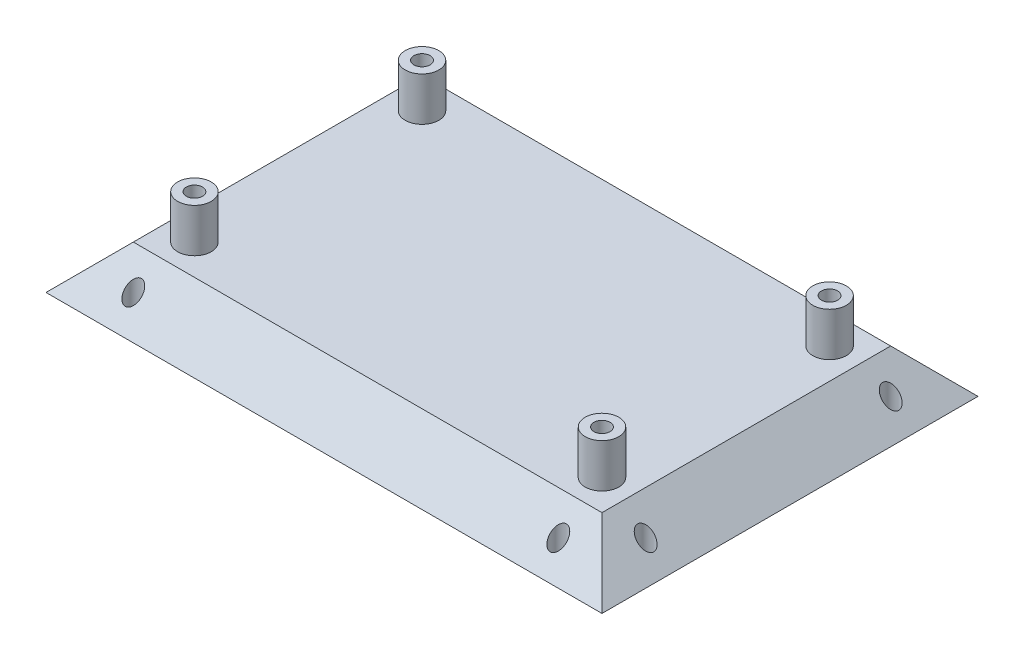
ISO-10303-21;
HEADER;
FILE_DESCRIPTION(('STEP AP214'),'2;1');
FILE_NAME('part.step','',(''),(''),'','','');
FILE_SCHEMA(('AUTOMOTIVE_DESIGN { 1 0 10303 214 1 1 1 1 }'));
ENDSEC;
DATA;
#1=APPLICATION_CONTEXT('core data for automotive mechanical design processes');
#2=APPLICATION_PROTOCOL_DEFINITION('international standard','automotive_design',2000,#1);
#3=PRODUCT_CONTEXT('',#1,'mechanical');
#4=PRODUCT('Part','Part','',(#3));
#5=PRODUCT_RELATED_PRODUCT_CATEGORY('part','',(#4));
#6=PRODUCT_DEFINITION_FORMATION('','',#4);
#7=PRODUCT_DEFINITION_CONTEXT('part definition',#1,'design');
#8=PRODUCT_DEFINITION('design','',#6,#7);
#9=PRODUCT_DEFINITION_SHAPE('','',#8);
#10=(LENGTH_UNIT() NAMED_UNIT(*) SI_UNIT(.MILLI.,.METRE.));
#11=(NAMED_UNIT(*) PLANE_ANGLE_UNIT() SI_UNIT($,.RADIAN.));
#12=(NAMED_UNIT(*) SI_UNIT($,.STERADIAN.) SOLID_ANGLE_UNIT());
#13=UNCERTAINTY_MEASURE_WITH_UNIT(LENGTH_MEASURE(1.E-05),#10,'distance_accuracy_value','');
#14=(GEOMETRIC_REPRESENTATION_CONTEXT(3) GLOBAL_UNCERTAINTY_ASSIGNED_CONTEXT((#13)) GLOBAL_UNIT_ASSIGNED_CONTEXT((#10,
#11,#12)) REPRESENTATION_CONTEXT('',''));
#15=CARTESIAN_POINT('',(0.,0.,0.));
#16=DIRECTION('',(0.,0.,1.));
#17=DIRECTION('',(1.,0.,0.));
#18=AXIS2_PLACEMENT_3D('',#15,#16,#17);
#19=CARTESIAN_POINT('',(0.,10.,0.));
#20=DIRECTION('',(0.,1.,0.));
#21=DIRECTION('',(0.,0.,1.));
#22=AXIS2_PLACEMENT_3D('',#19,#20,#21);
#23=PLANE('',#22);
#24=CARTESIAN_POINT('',(17.,10.,69.1254130139523));
#25=DIRECTION('',(0.,1.,0.));
#26=DIRECTION('',(0.,0.,-1.));
#27=AXIS2_PLACEMENT_3D('',#24,#25,#26);
#28=CIRCLE('',#27,3.85);
#29=CARTESIAN_POINT('',(17.,10.,65.2754130139523));
#30=VERTEX_POINT('',#29);
#31=EDGE_CURVE('E458',#30,#30,#28,.T.);
#32=ORIENTED_EDGE('',*,*,#31,.F.);
#33=EDGE_LOOP('',(#32));
#34=FACE_BOUND('',#33,.T.);
#35=CARTESIAN_POINT('',(17.,10.,17.));
#36=DIRECTION('',(0.,1.,0.));
#37=DIRECTION('',(0.,0.,1.));
#38=AXIS2_PLACEMENT_3D('',#35,#36,#37);
#39=CIRCLE('',#38,3.85);
#40=CARTESIAN_POINT('',(17.,10.,20.85));
#41=VERTEX_POINT('',#40);
#42=EDGE_CURVE('E449',#41,#41,#39,.T.);
#43=ORIENTED_EDGE('',*,*,#42,.F.);
#44=EDGE_LOOP('',(#43));
#45=FACE_BOUND('',#44,.T.);
#46=CARTESIAN_POINT('',(110.350077170021,10.,17.));
#47=DIRECTION('',(0.,1.,0.));
#48=DIRECTION('',(0.,0.,-1.));
#49=AXIS2_PLACEMENT_3D('',#46,#47,#48);
#50=CIRCLE('',#49,3.85);
#51=CARTESIAN_POINT('',(110.350077170021,10.,13.15));
#52=VERTEX_POINT('',#51);
#53=EDGE_CURVE('E440',#52,#52,#50,.T.);
#54=ORIENTED_EDGE('',*,*,#53,.F.);
#55=EDGE_LOOP('',(#54));
#56=FACE_BOUND('',#55,.T.);
#57=CARTESIAN_POINT('',(110.350077170021,10.,69.1254130139523));
#58=DIRECTION('',(0.,1.,0.));
#59=DIRECTION('',(0.,0.,1.));
#60=AXIS2_PLACEMENT_3D('',#57,#58,#59);
#61=CIRCLE('',#60,3.85);
#62=CARTESIAN_POINT('',(110.350077170021,10.,72.9754130139523));
#63=VERTEX_POINT('',#62);
#64=EDGE_CURVE('E431',#63,#63,#61,.T.);
#65=ORIENTED_EDGE('',*,*,#64,.F.);
#66=EDGE_LOOP('',(#65));
#67=FACE_BOUND('',#66,.T.);
#68=DIRECTION('',(-1.,0.,0.));
#69=VECTOR('',#68,1.);
#70=CARTESIAN_POINT('',(117.350077170021,10.,10.));
#71=LINE('',#70,#69);
#72=CARTESIAN_POINT('',(117.350077170021,10.,10.));
#73=VERTEX_POINT('',#72);
#74=CARTESIAN_POINT('',(9.99999999999999,10.,10.));
#75=VERTEX_POINT('',#74);
#76=EDGE_CURVE('E101',#73,#75,#71,.T.);
#77=ORIENTED_EDGE('',*,*,#76,.T.);
#78=DIRECTION('',(0.,0.,1.));
#79=VECTOR('',#78,1.);
#80=CARTESIAN_POINT('',(10.,10.,10.));
#81=LINE('',#80,#79);
#82=CARTESIAN_POINT('',(10.,10.,76.1254130139523));
#83=VERTEX_POINT('',#82);
#84=EDGE_CURVE('E98',#75,#83,#81,.T.);
#85=ORIENTED_EDGE('',*,*,#84,.T.);
#86=DIRECTION('',(1.,0.,0.));
#87=VECTOR('',#86,1.);
#88=CARTESIAN_POINT('',(10.,10.,76.1254130139523));
#89=LINE('',#88,#87);
#90=CARTESIAN_POINT('',(117.350077170021,10.,76.1254130139523));
#91=VERTEX_POINT('',#90);
#92=EDGE_CURVE('E182',#83,#91,#89,.T.);
#93=ORIENTED_EDGE('',*,*,#92,.T.);
#94=DIRECTION('',(0.,0.,-1.));
#95=VECTOR('',#94,1.);
#96=CARTESIAN_POINT('',(117.350077170021,10.,76.1254130139523));
#97=LINE('',#96,#95);
#98=EDGE_CURVE('E60',#91,#73,#97,.T.);
#99=ORIENTED_EDGE('',*,*,#98,.T.);
#100=EDGE_LOOP('',(#77,#85,#93,#99));
#101=FACE_BOUND('',#100,.T.);
#102=ADVANCED_FACE('F45',(#34,#45,#56,#67,#101),#23,.T.);
#103=CARTESIAN_POINT('',(0.,0.,0.));
#104=DIRECTION('',(0.,1.,0.));
#105=DIRECTION('',(0.,0.,1.));
#106=AXIS2_PLACEMENT_3D('',#103,#104,#105);
#107=PLANE('',#106);
#108=CARTESIAN_POINT('',(5.,0.,71.1254130139523));
#109=DIRECTION('',(0.,-1.,0.));
#110=DIRECTION('',(0.,0.,1.));
#111=AXIS2_PLACEMENT_3D('',#108,#109,#110);
#112=CIRCLE('',#111,1.85);
#113=CARTESIAN_POINT('',(5.,0.,72.9754130139523));
#114=VERTEX_POINT('',#113);
#115=EDGE_CURVE('E406',#114,#114,#112,.T.);
#116=ORIENTED_EDGE('',*,*,#115,.F.);
#117=EDGE_LOOP('',(#116));
#118=FACE_BOUND('',#117,.T.);
#119=CARTESIAN_POINT('',(122.350077170021,0.,71.1254130139523));
#120=DIRECTION('',(0.,-1.,0.));
#121=DIRECTION('',(0.,0.,-1.));
#122=AXIS2_PLACEMENT_3D('',#119,#120,#121);
#123=CIRCLE('',#122,1.85000000000001);
#124=CARTESIAN_POINT('',(122.350077170021,0.,69.2754130139522));
#125=VERTEX_POINT('',#124);
#126=EDGE_CURVE('E410',#125,#125,#123,.T.);
#127=ORIENTED_EDGE('',*,*,#126,.F.);
#128=EDGE_LOOP('',(#127));
#129=FACE_BOUND('',#128,.T.);
#130=CARTESIAN_POINT('',(122.350077170021,0.,15.));
#131=DIRECTION('',(0.,-1.,0.));
#132=DIRECTION('',(0.,0.,1.));
#133=AXIS2_PLACEMENT_3D('',#130,#131,#132);
#134=CIRCLE('',#133,1.85);
#135=CARTESIAN_POINT('',(122.350077170021,0.,16.85));
#136=VERTEX_POINT('',#135);
#137=EDGE_CURVE('E416',#136,#136,#134,.T.);
#138=ORIENTED_EDGE('',*,*,#137,.F.);
#139=EDGE_LOOP('',(#138));
#140=FACE_BOUND('',#139,.T.);
#141=CARTESIAN_POINT('',(15.,0.,5.));
#142=DIRECTION('',(0.,-1.,0.));
#143=DIRECTION('',(0.,0.,1.));
#144=AXIS2_PLACEMENT_3D('',#141,#142,#143);
#145=CIRCLE('',#144,1.85);
#146=CARTESIAN_POINT('',(15.,0.,6.85));
#147=VERTEX_POINT('',#146);
#148=EDGE_CURVE('E413',#147,#147,#145,.T.);
#149=ORIENTED_EDGE('',*,*,#148,.F.);
#150=EDGE_LOOP('',(#149));
#151=FACE_BOUND('',#150,.T.);
#152=CARTESIAN_POINT('',(15.,0.,81.1254130139523));
#153=DIRECTION('',(0.,-1.,0.));
#154=DIRECTION('',(0.,0.,-1.));
#155=AXIS2_PLACEMENT_3D('',#152,#153,#154);
#156=CIRCLE('',#155,1.85);
#157=CARTESIAN_POINT('',(15.,0.,79.2754130139523));
#158=VERTEX_POINT('',#157);
#159=EDGE_CURVE('E417',#158,#158,#156,.T.);
#160=ORIENTED_EDGE('',*,*,#159,.F.);
#161=EDGE_LOOP('',(#160));
#162=FACE_BOUND('',#161,.T.);
#163=CARTESIAN_POINT('',(112.350077170021,0.,81.1254130139523));
#164=DIRECTION('',(0.,-1.,0.));
#165=DIRECTION('',(0.,0.,1.));
#166=AXIS2_PLACEMENT_3D('',#163,#164,#165);
#167=CIRCLE('',#166,1.85000000000001);
#168=CARTESIAN_POINT('',(112.350077170021,0.,82.9754130139522));
#169=VERTEX_POINT('',#168);
#170=EDGE_CURVE('E425',#169,#169,#167,.T.);
#171=ORIENTED_EDGE('',*,*,#170,.F.);
#172=EDGE_LOOP('',(#171));
#173=FACE_BOUND('',#172,.T.);
#174=CARTESIAN_POINT('',(112.350077170021,0.,5.));
#175=DIRECTION('',(0.,-1.,0.));
#176=DIRECTION('',(0.,0.,-1.));
#177=AXIS2_PLACEMENT_3D('',#174,#175,#176);
#178=CIRCLE('',#177,1.85);
#179=CARTESIAN_POINT('',(112.350077170021,0.,3.15));
#180=VERTEX_POINT('',#179);
#181=EDGE_CURVE('E422',#180,#180,#178,.T.);
#182=ORIENTED_EDGE('',*,*,#181,.F.);
#183=EDGE_LOOP('',(#182));
#184=FACE_BOUND('',#183,.T.);
#185=CARTESIAN_POINT('',(5.,0.,15.));
#186=DIRECTION('',(0.,-1.,0.));
#187=DIRECTION('',(0.,0.,-1.));
#188=AXIS2_PLACEMENT_3D('',#185,#186,#187);
#189=CIRCLE('',#188,1.85);
#190=CARTESIAN_POINT('',(5.,0.,13.15));
#191=VERTEX_POINT('',#190);
#192=EDGE_CURVE('E359',#191,#191,#189,.T.);
#193=ORIENTED_EDGE('',*,*,#192,.F.);
#194=EDGE_LOOP('',(#193));
#195=FACE_BOUND('',#194,.T.);
#196=DIRECTION('',(0.,0.,1.));
#197=VECTOR('',#196,1.);
#198=CARTESIAN_POINT('',(0.,0.,0.));
#199=LINE('',#198,#197);
#200=CARTESIAN_POINT('',(0.,0.,0.));
#201=VERTEX_POINT('',#200);
#202=CARTESIAN_POINT('',(0.,0.,86.1254130139523));
#203=VERTEX_POINT('',#202);
#204=EDGE_CURVE('E94',#201,#203,#199,.T.);
#205=ORIENTED_EDGE('',*,*,#204,.F.);
#206=DIRECTION('',(-1.,0.,0.));
#207=VECTOR('',#206,1.);
#208=CARTESIAN_POINT('',(0.,0.,0.));
#209=LINE('',#208,#207);
#210=CARTESIAN_POINT('',(127.350077170021,0.,0.));
#211=VERTEX_POINT('',#210);
#212=EDGE_CURVE('E105',#211,#201,#209,.T.);
#213=ORIENTED_EDGE('',*,*,#212,.F.);
#214=DIRECTION('',(0.,0.,-1.));
#215=VECTOR('',#214,1.);
#216=CARTESIAN_POINT('',(127.350077170021,0.,0.));
#217=LINE('',#216,#215);
#218=CARTESIAN_POINT('',(127.350077170021,0.,86.1254130139523));
#219=VERTEX_POINT('',#218);
#220=EDGE_CURVE('E112',#219,#211,#217,.T.);
#221=ORIENTED_EDGE('',*,*,#220,.F.);
#222=DIRECTION('',(1.,0.,0.));
#223=VECTOR('',#222,1.);
#224=CARTESIAN_POINT('',(0.,0.,86.1254130139523));
#225=LINE('',#224,#223);
#226=EDGE_CURVE('E118',#203,#219,#225,.T.);
#227=ORIENTED_EDGE('',*,*,#226,.F.);
#228=EDGE_LOOP('',(#205,#213,#221,#227));
#229=FACE_BOUND('',#228,.T.);
#230=ADVANCED_FACE('F117',(#118,#129,#140,#151,#162,#173,#184,#195,#229),#107,.F.);
#231=CARTESIAN_POINT('',(0.,43.0627065069762,43.0627065069762));
#232=DIRECTION('',(0.,-0.707106781186547,-0.707106781186548));
#233=DIRECTION('',(0.,0.707106781186548,-0.707106781186547));
#234=AXIS2_PLACEMENT_3D('',#231,#232,#233);
#235=PLANE('',#234);
#236=CARTESIAN_POINT('',(15.,5.00000000000005,81.1254130139523));
#237=DIRECTION('',(0.,-0.707106781186547,-0.707106781186548));
#238=DIRECTION('',(0.,-0.707106781186548,0.707106781186547));
#239=AXIS2_PLACEMENT_3D('',#236,#237,#238);
#240=ELLIPSE('',#239,2.61629509039023,1.85);
#241=CARTESIAN_POINT('',(15.,3.15000000000005,82.9754130139523));
#242=VERTEX_POINT('',#241);
#243=EDGE_CURVE('E120',#242,#242,#240,.T.);
#244=ORIENTED_EDGE('',*,*,#243,.T.);
#245=EDGE_LOOP('',(#244));
#246=FACE_BOUND('',#245,.T.);
#247=CARTESIAN_POINT('',(112.350077170021,5.0000000000001,81.1254130139523));
#248=DIRECTION('',(0.,-0.707106781186547,-0.707106781186548));
#249=DIRECTION('',(0.,-0.707106781186548,0.707106781186547));
#250=AXIS2_PLACEMENT_3D('',#247,#248,#249);
#251=ELLIPSE('',#250,2.61629509039023,1.85000000000001);
#252=CARTESIAN_POINT('',(112.350077170021,3.1500000000001,82.9754130139522));
#253=VERTEX_POINT('',#252);
#254=EDGE_CURVE('E339',#253,#253,#251,.T.);
#255=ORIENTED_EDGE('',*,*,#254,.T.);
#256=EDGE_LOOP('',(#255));
#257=FACE_BOUND('',#256,.T.);
#258=DIRECTION('',(-0.577350269189626,0.577350269189626,-0.577350269189626));
#259=VECTOR('',#258,1.);
#260=CARTESIAN_POINT('',(127.350077170021,0.,86.1254130139523));
#261=LINE('',#260,#259);
#262=EDGE_CURVE('E69',#219,#91,#261,.T.);
#263=ORIENTED_EDGE('',*,*,#262,.T.);
#264=ORIENTED_EDGE('',*,*,#92,.F.);
#265=DIRECTION('',(0.577350269189626,0.577350269189626,-0.577350269189626));
#266=VECTOR('',#265,1.);
#267=CARTESIAN_POINT('',(0.,0.,86.1254130139523));
#268=LINE('',#267,#266);
#269=EDGE_CURVE('E203',#203,#83,#268,.T.);
#270=ORIENTED_EDGE('',*,*,#269,.F.);
#271=ORIENTED_EDGE('',*,*,#226,.T.);
#272=EDGE_LOOP('',(#263,#264,#270,#271));
#273=FACE_BOUND('',#272,.T.);
#274=ADVANCED_FACE('F141',(#246,#257,#273),#235,.F.);
#275=CARTESIAN_POINT('',(0.,0.,0.));
#276=DIRECTION('',(0.707106781186547,-0.707106781186547,0.));
#277=DIRECTION('',(0.707106781186548,0.707106781186548,0.));
#278=AXIS2_PLACEMENT_3D('',#275,#276,#277);
#279=PLANE('',#278);
#280=CARTESIAN_POINT('',(5.,5.,71.1254130139523));
#281=DIRECTION('',(0.707106781186547,-0.707106781186547,0.));
#282=DIRECTION('',(-0.707106781186548,-0.707106781186548,0.));
#283=AXIS2_PLACEMENT_3D('',#280,#281,#282);
#284=ELLIPSE('',#283,2.61629509039023,1.85);
#285=CARTESIAN_POINT('',(3.15,3.15,71.1254130139523));
#286=VERTEX_POINT('',#285);
#287=EDGE_CURVE('E342',#286,#286,#284,.T.);
#288=ORIENTED_EDGE('',*,*,#287,.T.);
#289=EDGE_LOOP('',(#288));
#290=FACE_BOUND('',#289,.T.);
#291=CARTESIAN_POINT('',(5.,5.,15.));
#292=DIRECTION('',(0.707106781186547,-0.707106781186547,0.));
#293=DIRECTION('',(-0.707106781186548,-0.707106781186548,0.));
#294=AXIS2_PLACEMENT_3D('',#291,#292,#293);
#295=ELLIPSE('',#294,2.61629509039023,1.85);
#296=CARTESIAN_POINT('',(3.15,3.15,15.));
#297=VERTEX_POINT('',#296);
#298=EDGE_CURVE('E345',#297,#297,#295,.T.);
#299=ORIENTED_EDGE('',*,*,#298,.T.);
#300=EDGE_LOOP('',(#299));
#301=FACE_BOUND('',#300,.T.);
#302=ORIENTED_EDGE('',*,*,#269,.T.);
#303=ORIENTED_EDGE('',*,*,#84,.F.);
#304=DIRECTION('',(0.577350269189626,0.577350269189626,0.577350269189626));
#305=VECTOR('',#304,1.);
#306=CARTESIAN_POINT('',(0.,0.,0.));
#307=LINE('',#306,#305);
#308=EDGE_CURVE('E89',#201,#75,#307,.T.);
#309=ORIENTED_EDGE('',*,*,#308,.F.);
#310=ORIENTED_EDGE('',*,*,#204,.T.);
#311=EDGE_LOOP('',(#302,#303,#309,#310));
#312=FACE_BOUND('',#311,.T.);
#313=ADVANCED_FACE('F92',(#290,#301,#312),#279,.F.);
#314=CARTESIAN_POINT('',(63.6750385850105,63.6750385850105,0.));
#315=DIRECTION('',(-0.707106781186548,-0.707106781186547,0.));
#316=DIRECTION('',(0.707106781186547,-0.707106781186548,0.));
#317=AXIS2_PLACEMENT_3D('',#314,#315,#316);
#318=PLANE('',#317);
#319=CARTESIAN_POINT('',(122.350077170021,5.00000000000001,71.1254130139523));
#320=DIRECTION('',(-0.707106781186548,-0.707106781186547,0.));
#321=DIRECTION('',(0.707106781186547,-0.707106781186548,0.));
#322=AXIS2_PLACEMENT_3D('',#319,#320,#321);
#323=ELLIPSE('',#322,2.61629509039023,1.85000000000001);
#324=CARTESIAN_POINT('',(124.200077170021,3.15,71.1254130139523));
#325=VERTEX_POINT('',#324);
#326=EDGE_CURVE('E348',#325,#325,#323,.T.);
#327=ORIENTED_EDGE('',*,*,#326,.T.);
#328=EDGE_LOOP('',(#327));
#329=FACE_BOUND('',#328,.T.);
#330=CARTESIAN_POINT('',(122.350077170021,5.00000000000001,15.));
#331=DIRECTION('',(-0.707106781186548,-0.707106781186547,0.));
#332=DIRECTION('',(0.707106781186547,-0.707106781186548,0.));
#333=AXIS2_PLACEMENT_3D('',#330,#331,#332);
#334=ELLIPSE('',#333,2.61629509039023,1.85);
#335=CARTESIAN_POINT('',(124.200077170021,3.15,15.));
#336=VERTEX_POINT('',#335);
#337=EDGE_CURVE('E350',#336,#336,#334,.T.);
#338=ORIENTED_EDGE('',*,*,#337,.T.);
#339=EDGE_LOOP('',(#338));
#340=FACE_BOUND('',#339,.T.);
#341=DIRECTION('',(-0.577350269189626,0.577350269189626,0.577350269189626));
#342=VECTOR('',#341,1.);
#343=CARTESIAN_POINT('',(127.350077170021,0.,0.));
#344=LINE('',#343,#342);
#345=EDGE_CURVE('E102',#211,#73,#344,.T.);
#346=ORIENTED_EDGE('',*,*,#345,.T.);
#347=ORIENTED_EDGE('',*,*,#98,.F.);
#348=ORIENTED_EDGE('',*,*,#262,.F.);
#349=ORIENTED_EDGE('',*,*,#220,.T.);
#350=EDGE_LOOP('',(#346,#347,#348,#349));
#351=FACE_BOUND('',#350,.T.);
#352=ADVANCED_FACE('F194',(#329,#340,#351),#318,.F.);
#353=CARTESIAN_POINT('',(0.,0.,0.));
#354=DIRECTION('',(0.,-0.707106781186547,0.707106781186547));
#355=DIRECTION('',(0.,-0.707106781186548,-0.707106781186548));
#356=AXIS2_PLACEMENT_3D('',#353,#354,#355);
#357=PLANE('',#356);
#358=CARTESIAN_POINT('',(15.,5.,5.));
#359=DIRECTION('',(0.,-0.707106781186547,0.707106781186547));
#360=DIRECTION('',(0.,-0.707106781186548,-0.707106781186548));
#361=AXIS2_PLACEMENT_3D('',#358,#359,#360);
#362=ELLIPSE('',#361,2.61629509039023,1.85);
#363=CARTESIAN_POINT('',(15.,3.15,3.15));
#364=VERTEX_POINT('',#363);
#365=EDGE_CURVE('E353',#364,#364,#362,.T.);
#366=ORIENTED_EDGE('',*,*,#365,.T.);
#367=EDGE_LOOP('',(#366));
#368=FACE_BOUND('',#367,.T.);
#369=CARTESIAN_POINT('',(112.350077170021,5.,5.));
#370=DIRECTION('',(0.,-0.707106781186547,0.707106781186547));
#371=DIRECTION('',(0.,-0.707106781186548,-0.707106781186548));
#372=AXIS2_PLACEMENT_3D('',#369,#370,#371);
#373=ELLIPSE('',#372,2.61629509039023,1.85);
#374=CARTESIAN_POINT('',(112.350077170021,3.15,3.15));
#375=VERTEX_POINT('',#374);
#376=EDGE_CURVE('E356',#375,#375,#373,.T.);
#377=ORIENTED_EDGE('',*,*,#376,.T.);
#378=EDGE_LOOP('',(#377));
#379=FACE_BOUND('',#378,.T.);
#380=ORIENTED_EDGE('',*,*,#308,.T.);
#381=ORIENTED_EDGE('',*,*,#76,.F.);
#382=ORIENTED_EDGE('',*,*,#345,.F.);
#383=ORIENTED_EDGE('',*,*,#212,.T.);
#384=EDGE_LOOP('',(#380,#381,#382,#383));
#385=FACE_BOUND('',#384,.T.);
#386=ADVANCED_FACE('F107',(#368,#379,#385),#357,.F.);
#387=CARTESIAN_POINT('',(112.350077170021,10.0001,5.));
#388=DIRECTION('',(0.,-1.,0.));
#389=DIRECTION('',(0.,0.,-1.));
#390=AXIS2_PLACEMENT_3D('',#387,#388,#389);
#391=CYLINDRICAL_SURFACE('',#390,1.85);
#392=ORIENTED_EDGE('',*,*,#181,.T.);
#393=EDGE_LOOP('',(#392));
#394=FACE_BOUND('',#393,.T.);
#395=ORIENTED_EDGE('',*,*,#376,.F.);
#396=EDGE_LOOP('',(#395));
#397=FACE_BOUND('',#396,.T.);
#398=ADVANCED_FACE('F252',(#394,#397),#391,.F.);
#399=CARTESIAN_POINT('',(15.,10.0001,5.));
#400=DIRECTION('',(0.,-1.,0.));
#401=DIRECTION('',(0.,0.,-1.));
#402=AXIS2_PLACEMENT_3D('',#399,#400,#401);
#403=CYLINDRICAL_SURFACE('',#402,1.85);
#404=ORIENTED_EDGE('',*,*,#148,.T.);
#405=EDGE_LOOP('',(#404));
#406=FACE_BOUND('',#405,.T.);
#407=ORIENTED_EDGE('',*,*,#365,.F.);
#408=EDGE_LOOP('',(#407));
#409=FACE_BOUND('',#408,.T.);
#410=ADVANCED_FACE('F502',(#406,#409),#403,.F.);
#411=CARTESIAN_POINT('',(122.350077170021,10.0001,15.));
#412=DIRECTION('',(0.,-1.,0.));
#413=DIRECTION('',(0.,0.,-1.));
#414=AXIS2_PLACEMENT_3D('',#411,#412,#413);
#415=CYLINDRICAL_SURFACE('',#414,1.85);
#416=ORIENTED_EDGE('',*,*,#137,.T.);
#417=EDGE_LOOP('',(#416));
#418=FACE_BOUND('',#417,.T.);
#419=ORIENTED_EDGE('',*,*,#337,.F.);
#420=EDGE_LOOP('',(#419));
#421=FACE_BOUND('',#420,.T.);
#422=ADVANCED_FACE('F510',(#418,#421),#415,.F.);
#423=CARTESIAN_POINT('',(122.350077170021,10.0001,71.1254130139523));
#424=DIRECTION('',(0.,-1.,0.));
#425=DIRECTION('',(0.,0.,-1.));
#426=AXIS2_PLACEMENT_3D('',#423,#424,#425);
#427=CYLINDRICAL_SURFACE('',#426,1.85000000000001);
#428=ORIENTED_EDGE('',*,*,#126,.T.);
#429=EDGE_LOOP('',(#428));
#430=FACE_BOUND('',#429,.T.);
#431=ORIENTED_EDGE('',*,*,#326,.F.);
#432=EDGE_LOOP('',(#431));
#433=FACE_BOUND('',#432,.T.);
#434=ADVANCED_FACE('F507',(#430,#433),#427,.F.);
#435=CARTESIAN_POINT('',(5.,10.0001,15.));
#436=DIRECTION('',(0.,-1.,0.));
#437=DIRECTION('',(0.,0.,-1.));
#438=AXIS2_PLACEMENT_3D('',#435,#436,#437);
#439=CYLINDRICAL_SURFACE('',#438,1.85);
#440=ORIENTED_EDGE('',*,*,#192,.T.);
#441=EDGE_LOOP('',(#440));
#442=FACE_BOUND('',#441,.T.);
#443=ORIENTED_EDGE('',*,*,#298,.F.);
#444=EDGE_LOOP('',(#443));
#445=FACE_BOUND('',#444,.T.);
#446=ADVANCED_FACE('F143',(#442,#445),#439,.F.);
#447=CARTESIAN_POINT('',(5.,10.0001,71.1254130139523));
#448=DIRECTION('',(0.,-1.,0.));
#449=DIRECTION('',(0.,0.,-1.));
#450=AXIS2_PLACEMENT_3D('',#447,#448,#449);
#451=CYLINDRICAL_SURFACE('',#450,1.85);
#452=ORIENTED_EDGE('',*,*,#115,.T.);
#453=EDGE_LOOP('',(#452));
#454=FACE_BOUND('',#453,.T.);
#455=ORIENTED_EDGE('',*,*,#287,.F.);
#456=EDGE_LOOP('',(#455));
#457=FACE_BOUND('',#456,.T.);
#458=ADVANCED_FACE('F498',(#454,#457),#451,.F.);
#459=CARTESIAN_POINT('',(112.350077170021,10.0001,81.1254130139523));
#460=DIRECTION('',(0.,-1.,0.));
#461=DIRECTION('',(0.,0.,-1.));
#462=AXIS2_PLACEMENT_3D('',#459,#460,#461);
#463=CYLINDRICAL_SURFACE('',#462,1.85000000000001);
#464=ORIENTED_EDGE('',*,*,#170,.T.);
#465=EDGE_LOOP('',(#464));
#466=FACE_BOUND('',#465,.T.);
#467=ORIENTED_EDGE('',*,*,#254,.F.);
#468=EDGE_LOOP('',(#467));
#469=FACE_BOUND('',#468,.T.);
#470=ADVANCED_FACE('F494',(#466,#469),#463,.F.);
#471=CARTESIAN_POINT('',(15.,10.0001,81.1254130139523));
#472=DIRECTION('',(0.,-1.,0.));
#473=DIRECTION('',(0.,0.,-1.));
#474=AXIS2_PLACEMENT_3D('',#471,#472,#473);
#475=CYLINDRICAL_SURFACE('',#474,1.85);
#476=ORIENTED_EDGE('',*,*,#159,.T.);
#477=EDGE_LOOP('',(#476));
#478=FACE_BOUND('',#477,.T.);
#479=ORIENTED_EDGE('',*,*,#243,.F.);
#480=EDGE_LOOP('',(#479));
#481=FACE_BOUND('',#480,.T.);
#482=ADVANCED_FACE('F487',(#478,#481),#475,.F.);
#483=CARTESIAN_POINT('',(110.350077170021,20.,69.1254130139523));
#484=DIRECTION('',(0.,1.,0.));
#485=DIRECTION('',(0.,0.,1.));
#486=AXIS2_PLACEMENT_3D('',#483,#484,#485);
#487=PLANE('',#486);
#488=CARTESIAN_POINT('',(110.350077170021,20.,69.1254130139523));
#489=DIRECTION('',(0.,1.,0.));
#490=DIRECTION('',(0.,0.,1.));
#491=AXIS2_PLACEMENT_3D('',#488,#489,#490);
#492=CIRCLE('',#491,3.85);
#493=CARTESIAN_POINT('',(110.350077170021,20.,72.9754130139523));
#494=VERTEX_POINT('',#493);
#495=EDGE_CURVE('E426',#494,#494,#492,.T.);
#496=ORIENTED_EDGE('',*,*,#495,.T.);
#497=EDGE_LOOP('',(#496));
#498=FACE_BOUND('',#497,.T.);
#499=CARTESIAN_POINT('',(110.350077170021,20.,69.1254130139523));
#500=DIRECTION('',(0.,1.,0.));
#501=DIRECTION('',(0.,0.,1.));
#502=AXIS2_PLACEMENT_3D('',#499,#500,#501);
#503=CIRCLE('',#502,1.85000000000001);
#504=CARTESIAN_POINT('',(110.350077170021,20.,70.9754130139523));
#505=VERTEX_POINT('',#504);
#506=EDGE_CURVE('E434',#505,#505,#503,.T.);
#507=ORIENTED_EDGE('',*,*,#506,.F.);
#508=EDGE_LOOP('',(#507));
#509=FACE_BOUND('',#508,.T.);
#510=ADVANCED_FACE('F484',(#498,#509),#487,.T.);
#511=CARTESIAN_POINT('',(110.350077170021,20.,69.1254130139523));
#512=DIRECTION('',(0.,-1.,0.));
#513=DIRECTION('',(0.,0.,-1.));
#514=AXIS2_PLACEMENT_3D('',#511,#512,#513);
#515=CYLINDRICAL_SURFACE('',#514,3.85);
#516=ORIENTED_EDGE('',*,*,#495,.F.);
#517=EDGE_LOOP('',(#516));
#518=FACE_BOUND('',#517,.T.);
#519=ORIENTED_EDGE('',*,*,#64,.T.);
#520=EDGE_LOOP('',(#519));
#521=FACE_BOUND('',#520,.T.);
#522=ADVANCED_FACE('F296',(#518,#521),#515,.T.);
#523=CARTESIAN_POINT('',(110.350077170021,20.,69.1254130139523));
#524=DIRECTION('',(0.,-1.,0.));
#525=DIRECTION('',(0.,0.,-1.));
#526=AXIS2_PLACEMENT_3D('',#523,#524,#525);
#527=CYLINDRICAL_SURFACE('',#526,1.85000000000001);
#528=ORIENTED_EDGE('',*,*,#506,.T.);
#529=EDGE_LOOP('',(#528));
#530=FACE_BOUND('',#529,.T.);
#531=CARTESIAN_POINT('',(110.350077170021,10.,69.1254130139523));
#532=DIRECTION('',(0.,1.,0.));
#533=DIRECTION('',(0.,0.,1.));
#534=AXIS2_PLACEMENT_3D('',#531,#532,#533);
#535=CIRCLE('',#534,1.85000000000001);
#536=CARTESIAN_POINT('',(110.350077170021,10.,70.9754130139523));
#537=VERTEX_POINT('',#536);
#538=EDGE_CURVE('E332',#537,#537,#535,.F.);
#539=ORIENTED_EDGE('',*,*,#538,.T.);
#540=EDGE_LOOP('',(#539));
#541=FACE_BOUND('',#540,.T.);
#542=ADVANCED_FACE('F286',(#530,#541),#527,.F.);
#543=ORIENTED_EDGE('',*,*,#538,.F.);
#544=EDGE_LOOP('',(#543));
#545=FACE_BOUND('',#544,.T.);
#546=ADVANCED_FACE('F275',(#545),#23,.T.);
#547=CARTESIAN_POINT('',(110.350077170021,20.,17.));
#548=DIRECTION('',(0.,-1.,0.));
#549=DIRECTION('',(0.,0.,-1.));
#550=AXIS2_PLACEMENT_3D('',#547,#548,#549);
#551=PLANE('',#550);
#552=CARTESIAN_POINT('',(110.350077170021,20.,17.));
#553=DIRECTION('',(0.,1.,0.));
#554=DIRECTION('',(0.,0.,-1.));
#555=AXIS2_PLACEMENT_3D('',#552,#553,#554);
#556=CIRCLE('',#555,3.85);
#557=CARTESIAN_POINT('',(110.350077170021,20.,13.15));
#558=VERTEX_POINT('',#557);
#559=EDGE_CURVE('E439',#558,#558,#556,.T.);
#560=ORIENTED_EDGE('',*,*,#559,.T.);
#561=EDGE_LOOP('',(#560));
#562=FACE_BOUND('',#561,.T.);
#563=CARTESIAN_POINT('',(110.350077170021,20.,17.));
#564=DIRECTION('',(0.,1.,0.));
#565=DIRECTION('',(0.,0.,-1.));
#566=AXIS2_PLACEMENT_3D('',#563,#564,#565);
#567=CIRCLE('',#566,1.85);
#568=CARTESIAN_POINT('',(110.350077170021,20.,15.15));
#569=VERTEX_POINT('',#568);
#570=EDGE_CURVE('E443',#569,#569,#567,.T.);
#571=ORIENTED_EDGE('',*,*,#570,.F.);
#572=EDGE_LOOP('',(#571));
#573=FACE_BOUND('',#572,.T.);
#574=ADVANCED_FACE('F285',(#562,#573),#551,.F.);
#575=CARTESIAN_POINT('',(110.350077170021,20.,17.));
#576=DIRECTION('',(0.,-1.,0.));
#577=DIRECTION('',(0.,0.,-1.));
#578=AXIS2_PLACEMENT_3D('',#575,#576,#577);
#579=CYLINDRICAL_SURFACE('',#578,3.85);
#580=ORIENTED_EDGE('',*,*,#559,.F.);
#581=EDGE_LOOP('',(#580));
#582=FACE_BOUND('',#581,.T.);
#583=ORIENTED_EDGE('',*,*,#53,.T.);
#584=EDGE_LOOP('',(#583));
#585=FACE_BOUND('',#584,.T.);
#586=ADVANCED_FACE('F293',(#582,#585),#579,.T.);
#587=CARTESIAN_POINT('',(110.350077170021,20.,17.));
#588=DIRECTION('',(0.,-1.,0.));
#589=DIRECTION('',(0.,0.,-1.));
#590=AXIS2_PLACEMENT_3D('',#587,#588,#589);
#591=CYLINDRICAL_SURFACE('',#590,1.85);
#592=ORIENTED_EDGE('',*,*,#570,.T.);
#593=EDGE_LOOP('',(#592));
#594=FACE_BOUND('',#593,.T.);
#595=CARTESIAN_POINT('',(110.350077170021,10.,17.));
#596=DIRECTION('',(0.,1.,0.));
#597=DIRECTION('',(0.,0.,1.));
#598=AXIS2_PLACEMENT_3D('',#595,#596,#597);
#599=CIRCLE('',#598,1.85);
#600=CARTESIAN_POINT('',(110.350077170021,10.,18.85));
#601=VERTEX_POINT('',#600);
#602=EDGE_CURVE('E330',#601,#601,#599,.F.);
#603=ORIENTED_EDGE('',*,*,#602,.T.);
#604=EDGE_LOOP('',(#603));
#605=FACE_BOUND('',#604,.T.);
#606=ADVANCED_FACE('F302',(#594,#605),#591,.F.);
#607=ORIENTED_EDGE('',*,*,#602,.F.);
#608=EDGE_LOOP('',(#607));
#609=FACE_BOUND('',#608,.T.);
#610=ADVANCED_FACE('F288',(#609),#23,.T.);
#611=CARTESIAN_POINT('',(17.,20.,17.));
#612=DIRECTION('',(0.,1.,0.));
#613=DIRECTION('',(0.,0.,1.));
#614=AXIS2_PLACEMENT_3D('',#611,#612,#613);
#615=PLANE('',#614);
#616=CARTESIAN_POINT('',(17.,20.,17.));
#617=DIRECTION('',(0.,1.,0.));
#618=DIRECTION('',(0.,0.,1.));
#619=AXIS2_PLACEMENT_3D('',#616,#617,#618);
#620=CIRCLE('',#619,3.85);
#621=CARTESIAN_POINT('',(17.,20.,20.85));
#622=VERTEX_POINT('',#621);
#623=EDGE_CURVE('E448',#622,#622,#620,.T.);
#624=ORIENTED_EDGE('',*,*,#623,.T.);
#625=EDGE_LOOP('',(#624));
#626=FACE_BOUND('',#625,.T.);
#627=CARTESIAN_POINT('',(17.,20.,17.));
#628=DIRECTION('',(0.,1.,0.));
#629=DIRECTION('',(0.,0.,1.));
#630=AXIS2_PLACEMENT_3D('',#627,#628,#629);
#631=CIRCLE('',#630,1.85);
#632=CARTESIAN_POINT('',(17.,20.,18.85));
#633=VERTEX_POINT('',#632);
#634=EDGE_CURVE('E452',#633,#633,#631,.T.);
#635=ORIENTED_EDGE('',*,*,#634,.F.);
#636=EDGE_LOOP('',(#635));
#637=FACE_BOUND('',#636,.T.);
#638=ADVANCED_FACE('F301',(#626,#637),#615,.T.);
#639=CARTESIAN_POINT('',(17.,20.,17.));
#640=DIRECTION('',(0.,-1.,0.));
#641=DIRECTION('',(0.,0.,-1.));
#642=AXIS2_PLACEMENT_3D('',#639,#640,#641);
#643=CYLINDRICAL_SURFACE('',#642,3.85);
#644=ORIENTED_EDGE('',*,*,#623,.F.);
#645=EDGE_LOOP('',(#644));
#646=FACE_BOUND('',#645,.T.);
#647=ORIENTED_EDGE('',*,*,#42,.T.);
#648=EDGE_LOOP('',(#647));
#649=FACE_BOUND('',#648,.T.);
#650=ADVANCED_FACE('F308',(#646,#649),#643,.T.);
#651=CARTESIAN_POINT('',(17.,20.,17.));
#652=DIRECTION('',(0.,-1.,0.));
#653=DIRECTION('',(0.,0.,-1.));
#654=AXIS2_PLACEMENT_3D('',#651,#652,#653);
#655=CYLINDRICAL_SURFACE('',#654,1.85);
#656=ORIENTED_EDGE('',*,*,#634,.T.);
#657=EDGE_LOOP('',(#656));
#658=FACE_BOUND('',#657,.T.);
#659=CARTESIAN_POINT('',(17.,10.,17.));
#660=DIRECTION('',(0.,1.,0.));
#661=DIRECTION('',(0.,0.,1.));
#662=AXIS2_PLACEMENT_3D('',#659,#660,#661);
#663=CIRCLE('',#662,1.85);
#664=CARTESIAN_POINT('',(17.,10.,18.85));
#665=VERTEX_POINT('',#664);
#666=EDGE_CURVE('E53',#665,#665,#663,.F.);
#667=ORIENTED_EDGE('',*,*,#666,.T.);
#668=EDGE_LOOP('',(#667));
#669=FACE_BOUND('',#668,.T.);
#670=ADVANCED_FACE('F316',(#658,#669),#655,.F.);
#671=ORIENTED_EDGE('',*,*,#666,.F.);
#672=EDGE_LOOP('',(#671));
#673=FACE_BOUND('',#672,.T.);
#674=ADVANCED_FACE('F283',(#673),#23,.T.);
#675=CARTESIAN_POINT('',(17.,20.,69.1254130139523));
#676=DIRECTION('',(0.,-1.,0.));
#677=DIRECTION('',(0.,0.,-1.));
#678=AXIS2_PLACEMENT_3D('',#675,#676,#677);
#679=PLANE('',#678);
#680=CARTESIAN_POINT('',(17.,20.,69.1254130139523));
#681=DIRECTION('',(0.,1.,0.));
#682=DIRECTION('',(0.,0.,-1.));
#683=AXIS2_PLACEMENT_3D('',#680,#681,#682);
#684=CIRCLE('',#683,3.85);
#685=CARTESIAN_POINT('',(17.,20.,65.2754130139523));
#686=VERTEX_POINT('',#685);
#687=EDGE_CURVE('E457',#686,#686,#684,.T.);
#688=ORIENTED_EDGE('',*,*,#687,.T.);
#689=EDGE_LOOP('',(#688));
#690=FACE_BOUND('',#689,.T.);
#691=CARTESIAN_POINT('',(17.,20.,69.1254130139523));
#692=DIRECTION('',(0.,1.,0.));
#693=DIRECTION('',(0.,0.,-1.));
#694=AXIS2_PLACEMENT_3D('',#691,#692,#693);
#695=CIRCLE('',#694,1.85);
#696=CARTESIAN_POINT('',(17.,20.,67.2754130139523));
#697=VERTEX_POINT('',#696);
#698=EDGE_CURVE('E461',#697,#697,#695,.T.);
#699=ORIENTED_EDGE('',*,*,#698,.F.);
#700=EDGE_LOOP('',(#699));
#701=FACE_BOUND('',#700,.T.);
#702=ADVANCED_FACE('F315',(#690,#701),#679,.F.);
#703=CARTESIAN_POINT('',(17.,20.,69.1254130139523));
#704=DIRECTION('',(0.,-1.,0.));
#705=DIRECTION('',(0.,0.,-1.));
#706=AXIS2_PLACEMENT_3D('',#703,#704,#705);
#707=CYLINDRICAL_SURFACE('',#706,3.85);
#708=ORIENTED_EDGE('',*,*,#687,.F.);
#709=EDGE_LOOP('',(#708));
#710=FACE_BOUND('',#709,.T.);
#711=ORIENTED_EDGE('',*,*,#31,.T.);
#712=EDGE_LOOP('',(#711));
#713=FACE_BOUND('',#712,.T.);
#714=ADVANCED_FACE('F322',(#710,#713),#707,.T.);
#715=CARTESIAN_POINT('',(17.,20.,69.1254130139523));
#716=DIRECTION('',(0.,-1.,0.));
#717=DIRECTION('',(0.,0.,-1.));
#718=AXIS2_PLACEMENT_3D('',#715,#716,#717);
#719=CYLINDRICAL_SURFACE('',#718,1.85);
#720=ORIENTED_EDGE('',*,*,#698,.T.);
#721=EDGE_LOOP('',(#720));
#722=FACE_BOUND('',#721,.T.);
#723=CARTESIAN_POINT('',(17.,10.,69.1254130139523));
#724=DIRECTION('',(0.,1.,0.));
#725=DIRECTION('',(0.,0.,1.));
#726=AXIS2_PLACEMENT_3D('',#723,#724,#725);
#727=CIRCLE('',#726,1.85);
#728=CARTESIAN_POINT('',(17.,10.,70.9754130139523));
#729=VERTEX_POINT('',#728);
#730=EDGE_CURVE('E12',#729,#729,#727,.F.);
#731=ORIENTED_EDGE('',*,*,#730,.T.);
#732=EDGE_LOOP('',(#731));
#733=FACE_BOUND('',#732,.T.);
#734=ADVANCED_FACE('F281',(#722,#733),#719,.F.);
#735=ORIENTED_EDGE('',*,*,#730,.F.);
#736=EDGE_LOOP('',(#735));
#737=FACE_BOUND('',#736,.T.);
#738=ADVANCED_FACE('F274',(#737),#23,.T.);
#739=CLOSED_SHELL('',(#102,#230,#274,#313,#352,#386,#398,#410,#422,#434,#446,#458,#470,#482,
#510,#522,#542,#546,#574,#586,#606,#610,#638,#650,#670,#674,#702,#714,#734,#738));
#740=MANIFOLD_SOLID_BREP('B2',#739);
#741=ADVANCED_BREP_SHAPE_REPRESENTATION('',(#18,#740),#14);
#742=SHAPE_DEFINITION_REPRESENTATION(#9,#741);
ENDSEC;
END-ISO-10303-21;
